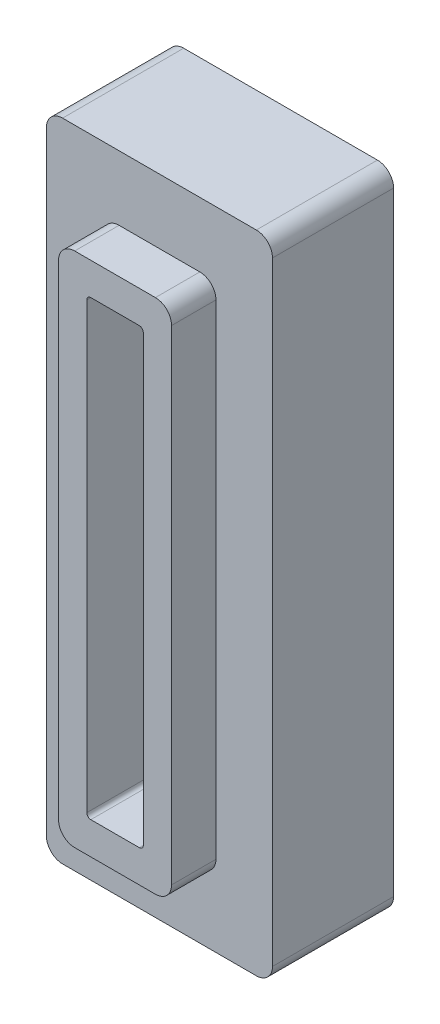
ISO-10303-21;
HEADER;
FILE_DESCRIPTION(('STEP AP214'),'2;1');
FILE_NAME('part.step','',(''),(''),'','','');
FILE_SCHEMA(('AUTOMOTIVE_DESIGN { 1 0 10303 214 1 1 1 1 }'));
ENDSEC;
DATA;
#1=APPLICATION_CONTEXT('core data for automotive mechanical design processes');
#2=APPLICATION_PROTOCOL_DEFINITION('international standard','automotive_design',2000,#1);
#3=PRODUCT_CONTEXT('',#1,'mechanical');
#4=PRODUCT('Part','Part','',(#3));
#5=PRODUCT_RELATED_PRODUCT_CATEGORY('part','',(#4));
#6=PRODUCT_DEFINITION_FORMATION('','',#4);
#7=PRODUCT_DEFINITION_CONTEXT('part definition',#1,'design');
#8=PRODUCT_DEFINITION('design','',#6,#7);
#9=PRODUCT_DEFINITION_SHAPE('','',#8);
#10=(LENGTH_UNIT() NAMED_UNIT(*) SI_UNIT(.MILLI.,.METRE.));
#11=(NAMED_UNIT(*) PLANE_ANGLE_UNIT() SI_UNIT($,.RADIAN.));
#12=(NAMED_UNIT(*) SI_UNIT($,.STERADIAN.) SOLID_ANGLE_UNIT());
#13=UNCERTAINTY_MEASURE_WITH_UNIT(LENGTH_MEASURE(1.E-05),#10,'distance_accuracy_value','');
#14=(GEOMETRIC_REPRESENTATION_CONTEXT(3) GLOBAL_UNCERTAINTY_ASSIGNED_CONTEXT((#13)) GLOBAL_UNIT_ASSIGNED_CONTEXT((#10,
#11,#12)) REPRESENTATION_CONTEXT('',''));
#15=CARTESIAN_POINT('',(0.,0.,0.));
#16=DIRECTION('',(0.,0.,1.));
#17=DIRECTION('',(1.,0.,0.));
#18=AXIS2_PLACEMENT_3D('',#15,#16,#17);
#19=CARTESIAN_POINT('',(0.,0.,1.5));
#20=DIRECTION('',(0.,0.,-1.));
#21=DIRECTION('',(-1.,0.,0.));
#22=AXIS2_PLACEMENT_3D('',#19,#20,#21);
#23=PLANE('',#22);
#24=DIRECTION('',(-1.,0.,0.));
#25=VECTOR('',#24,1.);
#26=CARTESIAN_POINT('',(-7.,20.,1.5));
#27=LINE('',#26,#25);
#28=CARTESIAN_POINT('',(5.99999999999999,20.,1.5));
#29=VERTEX_POINT('',#28);
#30=CARTESIAN_POINT('',(-6.00000000000001,20.,1.5));
#31=VERTEX_POINT('',#30);
#32=EDGE_CURVE('E460',#29,#31,#27,.T.);
#33=ORIENTED_EDGE('',*,*,#32,.T.);
#34=CARTESIAN_POINT('',(-6.,19.,1.5));
#35=DIRECTION('',(0.,0.,-1.));
#36=DIRECTION('',(-1.,0.,0.));
#37=AXIS2_PLACEMENT_3D('',#34,#35,#36);
#38=CIRCLE('',#37,1.);
#39=CARTESIAN_POINT('',(-7.,19.,1.5));
#40=VERTEX_POINT('',#39);
#41=EDGE_CURVE('E392',#31,#40,#38,.F.);
#42=ORIENTED_EDGE('',*,*,#41,.T.);
#43=DIRECTION('',(0.,-1.,0.));
#44=VECTOR('',#43,1.);
#45=CARTESIAN_POINT('',(-7.,-20.,1.5));
#46=LINE('',#45,#44);
#47=CARTESIAN_POINT('',(-7.,-19.,1.5));
#48=VERTEX_POINT('',#47);
#49=EDGE_CURVE('E276',#40,#48,#46,.T.);
#50=ORIENTED_EDGE('',*,*,#49,.T.);
#51=CARTESIAN_POINT('',(-6.,-19.,1.5));
#52=DIRECTION('',(0.,0.,-1.));
#53=DIRECTION('',(-1.,0.,0.));
#54=AXIS2_PLACEMENT_3D('',#51,#52,#53);
#55=CIRCLE('',#54,1.);
#56=CARTESIAN_POINT('',(-6.00000000000001,-20.,1.5));
#57=VERTEX_POINT('',#56);
#58=EDGE_CURVE('E57',#48,#57,#55,.F.);
#59=ORIENTED_EDGE('',*,*,#58,.T.);
#60=DIRECTION('',(1.,0.,0.));
#61=VECTOR('',#60,1.);
#62=CARTESIAN_POINT('',(-7.,-20.,1.5));
#63=LINE('',#62,#61);
#64=CARTESIAN_POINT('',(5.99999999999999,-20.,1.5));
#65=VERTEX_POINT('',#64);
#66=EDGE_CURVE('E272',#57,#65,#63,.T.);
#67=ORIENTED_EDGE('',*,*,#66,.T.);
#68=CARTESIAN_POINT('',(5.99999999999999,-19.,1.5));
#69=DIRECTION('',(0.,0.,-1.));
#70=DIRECTION('',(-1.,0.,0.));
#71=AXIS2_PLACEMENT_3D('',#68,#69,#70);
#72=CIRCLE('',#71,1.);
#73=CARTESIAN_POINT('',(6.99999999999999,-19.,1.5));
#74=VERTEX_POINT('',#73);
#75=EDGE_CURVE('E389',#65,#74,#72,.F.);
#76=ORIENTED_EDGE('',*,*,#75,.T.);
#77=DIRECTION('',(0.,1.,0.));
#78=VECTOR('',#77,1.);
#79=CARTESIAN_POINT('',(6.99999999999999,-20.,1.5));
#80=LINE('',#79,#78);
#81=CARTESIAN_POINT('',(6.99999999999999,19.,1.5));
#82=VERTEX_POINT('',#81);
#83=EDGE_CURVE('E457',#74,#82,#80,.T.);
#84=ORIENTED_EDGE('',*,*,#83,.T.);
#85=CARTESIAN_POINT('',(5.99999999999999,19.,1.5));
#86=DIRECTION('',(0.,0.,-1.));
#87=DIRECTION('',(-1.,0.,0.));
#88=AXIS2_PLACEMENT_3D('',#85,#86,#87);
#89=CIRCLE('',#88,1.);
#90=EDGE_CURVE('E387',#82,#29,#89,.F.);
#91=ORIENTED_EDGE('',*,*,#90,.T.);
#92=EDGE_LOOP('',(#33,#42,#50,#59,#67,#76,#84,#91));
#93=FACE_BOUND('',#92,.T.);
#94=DIRECTION('',(0.,1.,0.));
#95=VECTOR('',#94,1.);
#96=CARTESIAN_POINT('',(3.5,-16.,1.5));
#97=LINE('',#96,#95);
#98=CARTESIAN_POINT('',(3.5,-15.,1.5));
#99=VERTEX_POINT('',#98);
#100=CARTESIAN_POINT('',(3.5,15.,1.5));
#101=VERTEX_POINT('',#100);
#102=EDGE_CURVE('E410',#99,#101,#97,.T.);
#103=ORIENTED_EDGE('',*,*,#102,.F.);
#104=CARTESIAN_POINT('',(2.5,-15.,1.5));
#105=DIRECTION('',(0.,0.,-1.));
#106=DIRECTION('',(-1.,0.,0.));
#107=AXIS2_PLACEMENT_3D('',#104,#105,#106);
#108=CIRCLE('',#107,1.);
#109=CARTESIAN_POINT('',(2.5,-16.,1.5));
#110=VERTEX_POINT('',#109);
#111=EDGE_CURVE('E403',#99,#110,#108,.T.);
#112=ORIENTED_EDGE('',*,*,#111,.T.);
#113=DIRECTION('',(1.,0.,0.));
#114=VECTOR('',#113,1.);
#115=CARTESIAN_POINT('',(-3.5,-16.,1.5));
#116=LINE('',#115,#114);
#117=CARTESIAN_POINT('',(-2.5,-16.,1.5));
#118=VERTEX_POINT('',#117);
#119=EDGE_CURVE('E441',#118,#110,#116,.T.);
#120=ORIENTED_EDGE('',*,*,#119,.F.);
#121=CARTESIAN_POINT('',(-2.5,-15.,1.5));
#122=DIRECTION('',(0.,0.,-1.));
#123=DIRECTION('',(-1.,0.,0.));
#124=AXIS2_PLACEMENT_3D('',#121,#122,#123);
#125=CIRCLE('',#124,1.);
#126=CARTESIAN_POINT('',(-3.5,-15.,1.5));
#127=VERTEX_POINT('',#126);
#128=EDGE_CURVE('E405',#118,#127,#125,.T.);
#129=ORIENTED_EDGE('',*,*,#128,.T.);
#130=DIRECTION('',(0.,-1.,0.));
#131=VECTOR('',#130,1.);
#132=CARTESIAN_POINT('',(-3.5,-16.,1.5));
#133=LINE('',#132,#131);
#134=CARTESIAN_POINT('',(-3.5,15.,1.5));
#135=VERTEX_POINT('',#134);
#136=EDGE_CURVE('E447',#135,#127,#133,.T.);
#137=ORIENTED_EDGE('',*,*,#136,.F.);
#138=CARTESIAN_POINT('',(-2.5,15.,1.5));
#139=DIRECTION('',(0.,0.,-1.));
#140=DIRECTION('',(-1.,0.,0.));
#141=AXIS2_PLACEMENT_3D('',#138,#139,#140);
#142=CIRCLE('',#141,1.);
#143=CARTESIAN_POINT('',(-2.5,16.,1.5));
#144=VERTEX_POINT('',#143);
#145=EDGE_CURVE('E11',#135,#144,#142,.T.);
#146=ORIENTED_EDGE('',*,*,#145,.T.);
#147=DIRECTION('',(-1.,0.,0.));
#148=VECTOR('',#147,1.);
#149=CARTESIAN_POINT('',(-3.5,16.,1.5));
#150=LINE('',#149,#148);
#151=CARTESIAN_POINT('',(2.5,16.,1.5));
#152=VERTEX_POINT('',#151);
#153=EDGE_CURVE('E412',#152,#144,#150,.T.);
#154=ORIENTED_EDGE('',*,*,#153,.F.);
#155=CARTESIAN_POINT('',(2.5,15.,1.5));
#156=DIRECTION('',(0.,0.,-1.));
#157=DIRECTION('',(-1.,0.,0.));
#158=AXIS2_PLACEMENT_3D('',#155,#156,#157);
#159=CIRCLE('',#158,1.);
#160=EDGE_CURVE('E43',#152,#101,#159,.T.);
#161=ORIENTED_EDGE('',*,*,#160,.T.);
#162=EDGE_LOOP('',(#103,#112,#120,#129,#137,#146,#154,#161));
#163=FACE_BOUND('',#162,.T.);
#164=ADVANCED_FACE('F35',(#93,#163),#23,.F.);
#165=CARTESIAN_POINT('',(0.,0.,0.));
#166=DIRECTION('',(0.,0.,-1.));
#167=DIRECTION('',(-1.,0.,0.));
#168=AXIS2_PLACEMENT_3D('',#165,#166,#167);
#169=PLANE('',#168);
#170=DIRECTION('',(0.,-1.,0.));
#171=VECTOR('',#170,1.);
#172=CARTESIAN_POINT('',(4.9,-17.7,0.));
#173=LINE('',#172,#171);
#174=CARTESIAN_POINT('',(4.9,17.45,0.));
#175=VERTEX_POINT('',#174);
#176=CARTESIAN_POINT('',(4.9,-17.45,0.));
#177=VERTEX_POINT('',#176);
#178=EDGE_CURVE('E913',#175,#177,#173,.T.);
#179=ORIENTED_EDGE('',*,*,#178,.T.);
#180=CARTESIAN_POINT('',(4.65,-17.45,0.));
#181=DIRECTION('',(0.,0.,-1.));
#182=DIRECTION('',(-1.,0.,0.));
#183=AXIS2_PLACEMENT_3D('',#180,#181,#182);
#184=CIRCLE('',#183,0.25);
#185=CARTESIAN_POINT('',(4.65,-17.7,0.));
#186=VERTEX_POINT('',#185);
#187=EDGE_CURVE('E304',#177,#186,#184,.T.);
#188=ORIENTED_EDGE('',*,*,#187,.T.);
#189=DIRECTION('',(-1.,0.,0.));
#190=VECTOR('',#189,1.);
#191=CARTESIAN_POINT('',(4.9,-17.7,0.));
#192=LINE('',#191,#190);
#193=CARTESIAN_POINT('',(-4.65,-17.7,0.));
#194=VERTEX_POINT('',#193);
#195=EDGE_CURVE('E916',#186,#194,#192,.T.);
#196=ORIENTED_EDGE('',*,*,#195,.T.);
#197=CARTESIAN_POINT('',(-4.65,-17.45,0.));
#198=DIRECTION('',(0.,0.,-1.));
#199=DIRECTION('',(-1.,0.,0.));
#200=AXIS2_PLACEMENT_3D('',#197,#198,#199);
#201=CIRCLE('',#200,0.25);
#202=CARTESIAN_POINT('',(-4.9,-17.45,0.));
#203=VERTEX_POINT('',#202);
#204=EDGE_CURVE('E302',#194,#203,#201,.T.);
#205=ORIENTED_EDGE('',*,*,#204,.T.);
#206=DIRECTION('',(0.,1.,0.));
#207=VECTOR('',#206,1.);
#208=CARTESIAN_POINT('',(-4.9,-17.7,0.));
#209=LINE('',#208,#207);
#210=CARTESIAN_POINT('',(-4.9,17.45,0.));
#211=VERTEX_POINT('',#210);
#212=EDGE_CURVE('E885',#203,#211,#209,.T.);
#213=ORIENTED_EDGE('',*,*,#212,.T.);
#214=CARTESIAN_POINT('',(-4.65,17.45,0.));
#215=DIRECTION('',(0.,0.,-1.));
#216=DIRECTION('',(-1.,0.,0.));
#217=AXIS2_PLACEMENT_3D('',#214,#215,#216);
#218=CIRCLE('',#217,0.25);
#219=CARTESIAN_POINT('',(-4.65,17.7,0.));
#220=VERTEX_POINT('',#219);
#221=EDGE_CURVE('E300',#211,#220,#218,.T.);
#222=ORIENTED_EDGE('',*,*,#221,.T.);
#223=DIRECTION('',(1.,0.,0.));
#224=VECTOR('',#223,1.);
#225=CARTESIAN_POINT('',(4.9,17.7,0.));
#226=LINE('',#225,#224);
#227=CARTESIAN_POINT('',(4.65,17.7,0.));
#228=VERTEX_POINT('',#227);
#229=EDGE_CURVE('E890',#220,#228,#226,.T.);
#230=ORIENTED_EDGE('',*,*,#229,.T.);
#231=CARTESIAN_POINT('',(4.65,17.45,0.));
#232=DIRECTION('',(0.,0.,-1.));
#233=DIRECTION('',(-1.,0.,0.));
#234=AXIS2_PLACEMENT_3D('',#231,#232,#233);
#235=CIRCLE('',#234,0.25);
#236=EDGE_CURVE('E298',#228,#175,#235,.T.);
#237=ORIENTED_EDGE('',*,*,#236,.T.);
#238=EDGE_LOOP('',(#179,#188,#196,#205,#213,#222,#230,#237));
#239=FACE_BOUND('',#238,.T.);
#240=DIRECTION('',(0.,-1.,0.));
#241=VECTOR('',#240,1.);
#242=CARTESIAN_POINT('',(-1.75,-14.,0.));
#243=LINE('',#242,#241);
#244=CARTESIAN_POINT('',(-1.75,13.75,0.));
#245=VERTEX_POINT('',#244);
#246=CARTESIAN_POINT('',(-1.75,-13.75,0.));
#247=VERTEX_POINT('',#246);
#248=EDGE_CURVE('E454',#245,#247,#243,.T.);
#249=ORIENTED_EDGE('',*,*,#248,.T.);
#250=CARTESIAN_POINT('',(-1.5,-13.75,0.));
#251=DIRECTION('',(0.,0.,-1.));
#252=DIRECTION('',(-1.,0.,0.));
#253=AXIS2_PLACEMENT_3D('',#250,#251,#252);
#254=CIRCLE('',#253,0.25);
#255=CARTESIAN_POINT('',(-1.5,-14.,0.));
#256=VERTEX_POINT('',#255);
#257=EDGE_CURVE('E329',#247,#256,#254,.F.);
#258=ORIENTED_EDGE('',*,*,#257,.T.);
#259=DIRECTION('',(1.,0.,0.));
#260=VECTOR('',#259,1.);
#261=CARTESIAN_POINT('',(-1.75,-14.,0.));
#262=LINE('',#261,#260);
#263=CARTESIAN_POINT('',(1.5,-14.,0.));
#264=VERTEX_POINT('',#263);
#265=EDGE_CURVE('E251',#256,#264,#262,.T.);
#266=ORIENTED_EDGE('',*,*,#265,.T.);
#267=CARTESIAN_POINT('',(1.5,-13.75,0.));
#268=DIRECTION('',(0.,0.,-1.));
#269=DIRECTION('',(-1.,0.,0.));
#270=AXIS2_PLACEMENT_3D('',#267,#268,#269);
#271=CIRCLE('',#270,0.25);
#272=CARTESIAN_POINT('',(1.75,-13.75,0.));
#273=VERTEX_POINT('',#272);
#274=EDGE_CURVE('E245',#264,#273,#271,.F.);
#275=ORIENTED_EDGE('',*,*,#274,.T.);
#276=DIRECTION('',(0.,1.,0.));
#277=VECTOR('',#276,1.);
#278=CARTESIAN_POINT('',(1.75,-14.,0.));
#279=LINE('',#278,#277);
#280=CARTESIAN_POINT('',(1.75,13.75,0.));
#281=VERTEX_POINT('',#280);
#282=EDGE_CURVE('E249',#273,#281,#279,.T.);
#283=ORIENTED_EDGE('',*,*,#282,.T.);
#284=CARTESIAN_POINT('',(1.5,13.75,0.));
#285=DIRECTION('',(0.,0.,-1.));
#286=DIRECTION('',(-1.,0.,0.));
#287=AXIS2_PLACEMENT_3D('',#284,#285,#286);
#288=CIRCLE('',#287,0.25);
#289=CARTESIAN_POINT('',(1.5,14.,0.));
#290=VERTEX_POINT('',#289);
#291=EDGE_CURVE('E321',#281,#290,#288,.F.);
#292=ORIENTED_EDGE('',*,*,#291,.T.);
#293=DIRECTION('',(-1.,0.,0.));
#294=VECTOR('',#293,1.);
#295=CARTESIAN_POINT('',(-1.75,14.,0.));
#296=LINE('',#295,#294);
#297=CARTESIAN_POINT('',(-1.5,14.,0.));
#298=VERTEX_POINT('',#297);
#299=EDGE_CURVE('E267',#290,#298,#296,.T.);
#300=ORIENTED_EDGE('',*,*,#299,.T.);
#301=CARTESIAN_POINT('',(-1.5,13.75,0.));
#302=DIRECTION('',(0.,0.,-1.));
#303=DIRECTION('',(-1.,0.,0.));
#304=AXIS2_PLACEMENT_3D('',#301,#302,#303);
#305=CIRCLE('',#304,0.25);
#306=EDGE_CURVE('E325',#298,#245,#305,.F.);
#307=ORIENTED_EDGE('',*,*,#306,.T.);
#308=EDGE_LOOP('',(#249,#258,#266,#275,#283,#292,#300,#307));
#309=FACE_BOUND('',#308,.T.);
#310=ADVANCED_FACE('F248',(#239,#309),#169,.T.);
#311=CARTESIAN_POINT('',(6.99999999999999,-20.,1.5));
#312=DIRECTION('',(-1.,0.,0.));
#313=DIRECTION('',(0.,0.,1.));
#314=AXIS2_PLACEMENT_3D('',#311,#312,#313);
#315=PLANE('',#314);
#316=ORIENTED_EDGE('',*,*,#83,.F.);
#317=DIRECTION('',(0.,0.,-1.));
#318=VECTOR('',#317,1.);
#319=CARTESIAN_POINT('',(6.99999999999999,-19.,1.5));
#320=LINE('',#319,#318);
#321=CARTESIAN_POINT('',(6.99999999999999,-19.,-6.));
#322=VERTEX_POINT('',#321);
#323=EDGE_CURVE('E400',#74,#322,#320,.T.);
#324=ORIENTED_EDGE('',*,*,#323,.T.);
#325=DIRECTION('',(0.,-1.,0.));
#326=VECTOR('',#325,1.);
#327=CARTESIAN_POINT('',(6.99999999999999,20.,-6.));
#328=LINE('',#327,#326);
#329=CARTESIAN_POINT('',(6.99999999999999,19.,-6.));
#330=VERTEX_POINT('',#329);
#331=EDGE_CURVE('E480',#330,#322,#328,.T.);
#332=ORIENTED_EDGE('',*,*,#331,.F.);
#333=DIRECTION('',(0.,0.,-1.));
#334=VECTOR('',#333,1.);
#335=CARTESIAN_POINT('',(6.99999999999999,19.,1.5));
#336=LINE('',#335,#334);
#337=EDGE_CURVE('E398',#330,#82,#336,.F.);
#338=ORIENTED_EDGE('',*,*,#337,.T.);
#339=EDGE_LOOP('',(#316,#324,#332,#338));
#340=FACE_BOUND('',#339,.T.);
#341=ADVANCED_FACE('F537',(#340),#315,.F.);
#342=CARTESIAN_POINT('',(-7.,20.,1.5));
#343=DIRECTION('',(0.,-1.,0.));
#344=DIRECTION('',(0.,0.,-1.));
#345=AXIS2_PLACEMENT_3D('',#342,#343,#344);
#346=PLANE('',#345);
#347=DIRECTION('',(1.,0.,0.));
#348=VECTOR('',#347,1.);
#349=CARTESIAN_POINT('',(-7.,20.,-6.));
#350=LINE('',#349,#348);
#351=CARTESIAN_POINT('',(-6.00000000000001,20.,-6.));
#352=VERTEX_POINT('',#351);
#353=CARTESIAN_POINT('',(5.99999999999999,20.,-6.));
#354=VERTEX_POINT('',#353);
#355=EDGE_CURVE('E484',#352,#354,#350,.T.);
#356=ORIENTED_EDGE('',*,*,#355,.F.);
#357=DIRECTION('',(0.,0.,-1.));
#358=VECTOR('',#357,1.);
#359=CARTESIAN_POINT('',(-6.,20.,1.5));
#360=LINE('',#359,#358);
#361=EDGE_CURVE('E385',#352,#31,#360,.F.);
#362=ORIENTED_EDGE('',*,*,#361,.T.);
#363=ORIENTED_EDGE('',*,*,#32,.F.);
#364=DIRECTION('',(0.,0.,-1.));
#365=VECTOR('',#364,1.);
#366=CARTESIAN_POINT('',(5.99999999999999,20.,1.5));
#367=LINE('',#366,#365);
#368=EDGE_CURVE('E382',#29,#354,#367,.T.);
#369=ORIENTED_EDGE('',*,*,#368,.T.);
#370=EDGE_LOOP('',(#356,#362,#363,#369));
#371=FACE_BOUND('',#370,.T.);
#372=ADVANCED_FACE('F548',(#371),#346,.F.);
#373=CARTESIAN_POINT('',(-7.,-20.,1.5));
#374=DIRECTION('',(1.,0.,0.));
#375=DIRECTION('',(0.,0.,-1.));
#376=AXIS2_PLACEMENT_3D('',#373,#374,#375);
#377=PLANE('',#376);
#378=ORIENTED_EDGE('',*,*,#49,.F.);
#379=DIRECTION('',(0.,0.,-1.));
#380=VECTOR('',#379,1.);
#381=CARTESIAN_POINT('',(-7.,19.,1.5));
#382=LINE('',#381,#380);
#383=CARTESIAN_POINT('',(-7.,19.,-6.));
#384=VERTEX_POINT('',#383);
#385=EDGE_CURVE('E371',#40,#384,#382,.T.);
#386=ORIENTED_EDGE('',*,*,#385,.T.);
#387=DIRECTION('',(0.,1.,0.));
#388=VECTOR('',#387,1.);
#389=CARTESIAN_POINT('',(-7.,-20.,-6.));
#390=LINE('',#389,#388);
#391=CARTESIAN_POINT('',(-7.,-19.,-6.));
#392=VERTEX_POINT('',#391);
#393=EDGE_CURVE('E479',#392,#384,#390,.T.);
#394=ORIENTED_EDGE('',*,*,#393,.F.);
#395=DIRECTION('',(0.,0.,-1.));
#396=VECTOR('',#395,1.);
#397=CARTESIAN_POINT('',(-7.,-19.,1.5));
#398=LINE('',#397,#396);
#399=EDGE_CURVE('E369',#392,#48,#398,.F.);
#400=ORIENTED_EDGE('',*,*,#399,.T.);
#401=EDGE_LOOP('',(#378,#386,#394,#400));
#402=FACE_BOUND('',#401,.T.);
#403=ADVANCED_FACE('F545',(#402),#377,.F.);
#404=CARTESIAN_POINT('',(-7.,-20.,1.5));
#405=DIRECTION('',(0.,1.,0.));
#406=DIRECTION('',(0.,0.,1.));
#407=AXIS2_PLACEMENT_3D('',#404,#405,#406);
#408=PLANE('',#407);
#409=ORIENTED_EDGE('',*,*,#66,.F.);
#410=DIRECTION('',(0.,0.,-1.));
#411=VECTOR('',#410,1.);
#412=CARTESIAN_POINT('',(-6.,-20.,1.5));
#413=LINE('',#412,#411);
#414=CARTESIAN_POINT('',(-6.,-20.,-6.));
#415=VERTEX_POINT('',#414);
#416=EDGE_CURVE('E395',#57,#415,#413,.T.);
#417=ORIENTED_EDGE('',*,*,#416,.T.);
#418=DIRECTION('',(-1.,0.,0.));
#419=VECTOR('',#418,1.);
#420=CARTESIAN_POINT('',(6.99999999999999,-20.,-6.));
#421=LINE('',#420,#419);
#422=CARTESIAN_POINT('',(5.99999999999999,-20.,-6.));
#423=VERTEX_POINT('',#422);
#424=EDGE_CURVE('E472',#423,#415,#421,.T.);
#425=ORIENTED_EDGE('',*,*,#424,.F.);
#426=DIRECTION('',(0.,0.,-1.));
#427=VECTOR('',#426,1.);
#428=CARTESIAN_POINT('',(5.99999999999999,-20.,1.5));
#429=LINE('',#428,#427);
#430=EDGE_CURVE('E50',#423,#65,#429,.F.);
#431=ORIENTED_EDGE('',*,*,#430,.T.);
#432=EDGE_LOOP('',(#409,#417,#425,#431));
#433=FACE_BOUND('',#432,.T.);
#434=ADVANCED_FACE('F471',(#433),#408,.F.);
#435=CARTESIAN_POINT('',(1.75,-14.,1.5));
#436=DIRECTION('',(-1.,0.,0.));
#437=DIRECTION('',(0.,0.,1.));
#438=AXIS2_PLACEMENT_3D('',#435,#436,#437);
#439=PLANE('',#438);
#440=DIRECTION('',(0.,1.,0.));
#441=VECTOR('',#440,1.);
#442=CARTESIAN_POINT('',(1.75,-14.,4.25));
#443=LINE('',#442,#441);
#444=CARTESIAN_POINT('',(1.75,-13.75,4.25));
#445=VERTEX_POINT('',#444);
#446=CARTESIAN_POINT('',(1.75,13.75,4.25));
#447=VERTEX_POINT('',#446);
#448=EDGE_CURVE('E493',#445,#447,#443,.T.);
#449=ORIENTED_EDGE('',*,*,#448,.T.);
#450=DIRECTION('',(0.,0.,-1.));
#451=VECTOR('',#450,1.);
#452=CARTESIAN_POINT('',(1.75,13.75,0.));
#453=LINE('',#452,#451);
#454=EDGE_CURVE('E266',#447,#281,#453,.T.);
#455=ORIENTED_EDGE('',*,*,#454,.T.);
#456=ORIENTED_EDGE('',*,*,#282,.F.);
#457=DIRECTION('',(0.,0.,-1.));
#458=VECTOR('',#457,1.);
#459=CARTESIAN_POINT('',(1.75,-13.75,4.25));
#460=LINE('',#459,#458);
#461=EDGE_CURVE('E263',#273,#445,#460,.F.);
#462=ORIENTED_EDGE('',*,*,#461,.T.);
#463=EDGE_LOOP('',(#449,#455,#456,#462));
#464=FACE_BOUND('',#463,.T.);
#465=ADVANCED_FACE('F262',(#464),#439,.T.);
#466=CARTESIAN_POINT('',(-1.75,14.,1.5));
#467=DIRECTION('',(0.,-1.,0.));
#468=DIRECTION('',(0.,0.,-1.));
#469=AXIS2_PLACEMENT_3D('',#466,#467,#468);
#470=PLANE('',#469);
#471=ORIENTED_EDGE('',*,*,#299,.F.);
#472=DIRECTION('',(0.,0.,-1.));
#473=VECTOR('',#472,1.);
#474=CARTESIAN_POINT('',(1.5,14.,4.25));
#475=LINE('',#474,#473);
#476=CARTESIAN_POINT('',(1.5,14.,4.25));
#477=VERTEX_POINT('',#476);
#478=EDGE_CURVE('E282',#290,#477,#475,.F.);
#479=ORIENTED_EDGE('',*,*,#478,.T.);
#480=DIRECTION('',(-1.,0.,0.));
#481=VECTOR('',#480,1.);
#482=CARTESIAN_POINT('',(1.75,14.,4.25));
#483=LINE('',#482,#481);
#484=CARTESIAN_POINT('',(-1.5,14.,4.25));
#485=VERTEX_POINT('',#484);
#486=EDGE_CURVE('E421',#477,#485,#483,.T.);
#487=ORIENTED_EDGE('',*,*,#486,.T.);
#488=DIRECTION('',(0.,0.,-1.));
#489=VECTOR('',#488,1.);
#490=CARTESIAN_POINT('',(-1.5,14.,0.));
#491=LINE('',#490,#489);
#492=EDGE_CURVE('E274',#485,#298,#491,.T.);
#493=ORIENTED_EDGE('',*,*,#492,.T.);
#494=EDGE_LOOP('',(#471,#479,#487,#493));
#495=FACE_BOUND('',#494,.T.);
#496=ADVANCED_FACE('F499',(#495),#470,.T.);
#497=CARTESIAN_POINT('',(-1.75,-14.,1.5));
#498=DIRECTION('',(1.,0.,0.));
#499=DIRECTION('',(0.,0.,-1.));
#500=AXIS2_PLACEMENT_3D('',#497,#498,#499);
#501=PLANE('',#500);
#502=ORIENTED_EDGE('',*,*,#248,.F.);
#503=DIRECTION('',(0.,0.,-1.));
#504=VECTOR('',#503,1.);
#505=CARTESIAN_POINT('',(-1.75,13.75,4.25));
#506=LINE('',#505,#504);
#507=CARTESIAN_POINT('',(-1.75,13.75,4.25));
#508=VERTEX_POINT('',#507);
#509=EDGE_CURVE('E287',#245,#508,#506,.F.);
#510=ORIENTED_EDGE('',*,*,#509,.T.);
#511=DIRECTION('',(0.,-1.,0.));
#512=VECTOR('',#511,1.);
#513=CARTESIAN_POINT('',(-1.75,14.,4.25));
#514=LINE('',#513,#512);
#515=CARTESIAN_POINT('',(-1.75,-13.75,4.25));
#516=VERTEX_POINT('',#515);
#517=EDGE_CURVE('E482',#508,#516,#514,.T.);
#518=ORIENTED_EDGE('',*,*,#517,.T.);
#519=DIRECTION('',(0.,0.,-1.));
#520=VECTOR('',#519,1.);
#521=CARTESIAN_POINT('',(-1.75,-13.75,0.));
#522=LINE('',#521,#520);
#523=EDGE_CURVE('E284',#516,#247,#522,.T.);
#524=ORIENTED_EDGE('',*,*,#523,.T.);
#525=EDGE_LOOP('',(#502,#510,#518,#524));
#526=FACE_BOUND('',#525,.T.);
#527=ADVANCED_FACE('F508',(#526),#501,.T.);
#528=CARTESIAN_POINT('',(-1.75,-14.,1.5));
#529=DIRECTION('',(0.,1.,0.));
#530=DIRECTION('',(0.,0.,1.));
#531=AXIS2_PLACEMENT_3D('',#528,#529,#530);
#532=PLANE('',#531);
#533=ORIENTED_EDGE('',*,*,#265,.F.);
#534=DIRECTION('',(0.,0.,-1.));
#535=VECTOR('',#534,1.);
#536=CARTESIAN_POINT('',(-1.5,-14.,4.25));
#537=LINE('',#536,#535);
#538=CARTESIAN_POINT('',(-1.5,-14.,4.25));
#539=VERTEX_POINT('',#538);
#540=EDGE_CURVE('E291',#256,#539,#537,.F.);
#541=ORIENTED_EDGE('',*,*,#540,.T.);
#542=DIRECTION('',(1.,0.,0.));
#543=VECTOR('',#542,1.);
#544=CARTESIAN_POINT('',(-1.75,-14.,4.25));
#545=LINE('',#544,#543);
#546=CARTESIAN_POINT('',(1.5,-14.,4.25));
#547=VERTEX_POINT('',#546);
#548=EDGE_CURVE('E490',#539,#547,#545,.T.);
#549=ORIENTED_EDGE('',*,*,#548,.T.);
#550=DIRECTION('',(0.,0.,-1.));
#551=VECTOR('',#550,1.);
#552=CARTESIAN_POINT('',(1.5,-14.,0.));
#553=LINE('',#552,#551);
#554=EDGE_CURVE('E289',#547,#264,#553,.T.);
#555=ORIENTED_EDGE('',*,*,#554,.T.);
#556=EDGE_LOOP('',(#533,#541,#549,#555));
#557=FACE_BOUND('',#556,.T.);
#558=ADVANCED_FACE('F516',(#557),#532,.T.);
#559=CARTESIAN_POINT('',(0.,0.,4.25));
#560=DIRECTION('',(0.,0.,-1.));
#561=DIRECTION('',(-1.,0.,0.));
#562=AXIS2_PLACEMENT_3D('',#559,#560,#561);
#563=PLANE('',#562);
#564=DIRECTION('',(1.,0.,0.));
#565=VECTOR('',#564,1.);
#566=CARTESIAN_POINT('',(-3.5,-16.,4.25));
#567=LINE('',#566,#565);
#568=CARTESIAN_POINT('',(-2.5,-16.,4.25));
#569=VERTEX_POINT('',#568);
#570=CARTESIAN_POINT('',(2.5,-16.,4.25));
#571=VERTEX_POINT('',#570);
#572=EDGE_CURVE('E268',#569,#571,#567,.T.);
#573=ORIENTED_EDGE('',*,*,#572,.T.);
#574=CARTESIAN_POINT('',(2.5,-15.,4.25));
#575=DIRECTION('',(0.,0.,-1.));
#576=DIRECTION('',(-1.,0.,0.));
#577=AXIS2_PLACEMENT_3D('',#574,#575,#576);
#578=CIRCLE('',#577,1.);
#579=CARTESIAN_POINT('',(3.5,-15.,4.25));
#580=VERTEX_POINT('',#579);
#581=EDGE_CURVE('E357',#571,#580,#578,.F.);
#582=ORIENTED_EDGE('',*,*,#581,.T.);
#583=DIRECTION('',(0.,1.,0.));
#584=VECTOR('',#583,1.);
#585=CARTESIAN_POINT('',(3.5,-16.,4.25));
#586=LINE('',#585,#584);
#587=CARTESIAN_POINT('',(3.5,15.,4.25));
#588=VERTEX_POINT('',#587);
#589=EDGE_CURVE('E433',#580,#588,#586,.T.);
#590=ORIENTED_EDGE('',*,*,#589,.T.);
#591=CARTESIAN_POINT('',(2.5,15.,4.25));
#592=DIRECTION('',(0.,0.,-1.));
#593=DIRECTION('',(-1.,0.,0.));
#594=AXIS2_PLACEMENT_3D('',#591,#592,#593);
#595=CIRCLE('',#594,1.);
#596=CARTESIAN_POINT('',(2.5,16.,4.25));
#597=VERTEX_POINT('',#596);
#598=EDGE_CURVE('E353',#588,#597,#595,.F.);
#599=ORIENTED_EDGE('',*,*,#598,.T.);
#600=DIRECTION('',(-1.,0.,0.));
#601=VECTOR('',#600,1.);
#602=CARTESIAN_POINT('',(-3.5,16.,4.25));
#603=LINE('',#602,#601);
#604=CARTESIAN_POINT('',(-2.5,16.,4.25));
#605=VERTEX_POINT('',#604);
#606=EDGE_CURVE('E431',#597,#605,#603,.T.);
#607=ORIENTED_EDGE('',*,*,#606,.T.);
#608=CARTESIAN_POINT('',(-2.5,15.,4.25));
#609=DIRECTION('',(0.,0.,-1.));
#610=DIRECTION('',(-1.,0.,0.));
#611=AXIS2_PLACEMENT_3D('',#608,#609,#610);
#612=CIRCLE('',#611,1.);
#613=CARTESIAN_POINT('',(-3.5,15.,4.25));
#614=VERTEX_POINT('',#613);
#615=EDGE_CURVE('E351',#605,#614,#612,.F.);
#616=ORIENTED_EDGE('',*,*,#615,.T.);
#617=DIRECTION('',(0.,-1.,0.));
#618=VECTOR('',#617,1.);
#619=CARTESIAN_POINT('',(-3.5,-16.,4.25));
#620=LINE('',#619,#618);
#621=CARTESIAN_POINT('',(-3.5,-15.,4.25));
#622=VERTEX_POINT('',#621);
#623=EDGE_CURVE('E437',#614,#622,#620,.T.);
#624=ORIENTED_EDGE('',*,*,#623,.T.);
#625=CARTESIAN_POINT('',(-2.5,-15.,4.25));
#626=DIRECTION('',(0.,0.,-1.));
#627=DIRECTION('',(-1.,0.,0.));
#628=AXIS2_PLACEMENT_3D('',#625,#626,#627);
#629=CIRCLE('',#628,1.);
#630=EDGE_CURVE('E355',#622,#569,#629,.F.);
#631=ORIENTED_EDGE('',*,*,#630,.T.);
#632=EDGE_LOOP('',(#573,#582,#590,#599,#607,#616,#624,#631));
#633=FACE_BOUND('',#632,.T.);
#634=ORIENTED_EDGE('',*,*,#517,.F.);
#635=CARTESIAN_POINT('',(-1.5,13.75,4.25));
#636=DIRECTION('',(0.,0.,-1.));
#637=DIRECTION('',(-1.,0.,0.));
#638=AXIS2_PLACEMENT_3D('',#635,#636,#637);
#639=CIRCLE('',#638,0.25);
#640=EDGE_CURVE('E327',#508,#485,#639,.T.);
#641=ORIENTED_EDGE('',*,*,#640,.T.);
#642=ORIENTED_EDGE('',*,*,#486,.F.);
#643=CARTESIAN_POINT('',(1.5,13.75,4.25));
#644=DIRECTION('',(0.,0.,-1.));
#645=DIRECTION('',(-1.,0.,0.));
#646=AXIS2_PLACEMENT_3D('',#643,#644,#645);
#647=CIRCLE('',#646,0.25);
#648=EDGE_CURVE('E323',#477,#447,#647,.T.);
#649=ORIENTED_EDGE('',*,*,#648,.T.);
#650=ORIENTED_EDGE('',*,*,#448,.F.);
#651=CARTESIAN_POINT('',(1.5,-13.75,4.25));
#652=DIRECTION('',(0.,0.,-1.));
#653=DIRECTION('',(-1.,0.,0.));
#654=AXIS2_PLACEMENT_3D('',#651,#652,#653);
#655=CIRCLE('',#654,0.25);
#656=EDGE_CURVE('E256',#445,#547,#655,.T.);
#657=ORIENTED_EDGE('',*,*,#656,.T.);
#658=ORIENTED_EDGE('',*,*,#548,.F.);
#659=CARTESIAN_POINT('',(-1.5,-13.75,4.25));
#660=DIRECTION('',(0.,0.,-1.));
#661=DIRECTION('',(-1.,0.,0.));
#662=AXIS2_PLACEMENT_3D('',#659,#660,#661);
#663=CIRCLE('',#662,0.25);
#664=EDGE_CURVE('E257',#539,#516,#663,.T.);
#665=ORIENTED_EDGE('',*,*,#664,.T.);
#666=EDGE_LOOP('',(#634,#641,#642,#649,#650,#657,#658,#665));
#667=FACE_BOUND('',#666,.T.);
#668=ADVANCED_FACE('F429',(#633,#667),#563,.F.);
#669=CARTESIAN_POINT('',(3.5,-16.,4.25));
#670=DIRECTION('',(-1.,0.,0.));
#671=DIRECTION('',(0.,0.,1.));
#672=AXIS2_PLACEMENT_3D('',#669,#670,#671);
#673=PLANE('',#672);
#674=ORIENTED_EDGE('',*,*,#589,.F.);
#675=DIRECTION('',(0.,0.,-1.));
#676=VECTOR('',#675,1.);
#677=CARTESIAN_POINT('',(3.5,-15.,4.25));
#678=LINE('',#677,#676);
#679=EDGE_CURVE('E343',#580,#99,#678,.T.);
#680=ORIENTED_EDGE('',*,*,#679,.T.);
#681=ORIENTED_EDGE('',*,*,#102,.T.);
#682=DIRECTION('',(0.,0.,-1.));
#683=VECTOR('',#682,1.);
#684=CARTESIAN_POINT('',(3.5,15.,4.25));
#685=LINE('',#684,#683);
#686=EDGE_CURVE('E341',#101,#588,#685,.F.);
#687=ORIENTED_EDGE('',*,*,#686,.T.);
#688=EDGE_LOOP('',(#674,#680,#681,#687));
#689=FACE_BOUND('',#688,.T.);
#690=ADVANCED_FACE('F418',(#689),#673,.F.);
#691=CARTESIAN_POINT('',(-3.5,16.,4.25));
#692=DIRECTION('',(0.,-1.,0.));
#693=DIRECTION('',(0.,0.,-1.));
#694=AXIS2_PLACEMENT_3D('',#691,#692,#693);
#695=PLANE('',#694);
#696=ORIENTED_EDGE('',*,*,#606,.F.);
#697=DIRECTION('',(0.,0.,-1.));
#698=VECTOR('',#697,1.);
#699=CARTESIAN_POINT('',(2.5,16.,4.25));
#700=LINE('',#699,#698);
#701=EDGE_CURVE('E366',#597,#152,#700,.T.);
#702=ORIENTED_EDGE('',*,*,#701,.T.);
#703=ORIENTED_EDGE('',*,*,#153,.T.);
#704=DIRECTION('',(0.,0.,-1.));
#705=VECTOR('',#704,1.);
#706=CARTESIAN_POINT('',(-2.5,16.,4.25));
#707=LINE('',#706,#705);
#708=EDGE_CURVE('E364',#144,#605,#707,.F.);
#709=ORIENTED_EDGE('',*,*,#708,.T.);
#710=EDGE_LOOP('',(#696,#702,#703,#709));
#711=FACE_BOUND('',#710,.T.);
#712=ADVANCED_FACE('F435',(#711),#695,.F.);
#713=CARTESIAN_POINT('',(-3.5,-16.,4.25));
#714=DIRECTION('',(1.,0.,0.));
#715=DIRECTION('',(0.,0.,-1.));
#716=AXIS2_PLACEMENT_3D('',#713,#714,#715);
#717=PLANE('',#716);
#718=ORIENTED_EDGE('',*,*,#136,.T.);
#719=DIRECTION('',(0.,0.,-1.));
#720=VECTOR('',#719,1.);
#721=CARTESIAN_POINT('',(-3.5,-15.,4.25));
#722=LINE('',#721,#720);
#723=EDGE_CURVE('E362',#127,#622,#722,.F.);
#724=ORIENTED_EDGE('',*,*,#723,.T.);
#725=ORIENTED_EDGE('',*,*,#623,.F.);
#726=DIRECTION('',(0.,0.,-1.));
#727=VECTOR('',#726,1.);
#728=CARTESIAN_POINT('',(-3.5,15.,4.25));
#729=LINE('',#728,#727);
#730=EDGE_CURVE('E359',#614,#135,#729,.T.);
#731=ORIENTED_EDGE('',*,*,#730,.T.);
#732=EDGE_LOOP('',(#718,#724,#725,#731));
#733=FACE_BOUND('',#732,.T.);
#734=ADVANCED_FACE('F780',(#733),#717,.F.);
#735=CARTESIAN_POINT('',(-3.5,-16.,4.25));
#736=DIRECTION('',(0.,1.,0.));
#737=DIRECTION('',(0.,0.,1.));
#738=AXIS2_PLACEMENT_3D('',#735,#736,#737);
#739=PLANE('',#738);
#740=ORIENTED_EDGE('',*,*,#119,.T.);
#741=DIRECTION('',(0.,0.,-1.));
#742=VECTOR('',#741,1.);
#743=CARTESIAN_POINT('',(2.5,-16.,4.25));
#744=LINE('',#743,#742);
#745=EDGE_CURVE('E349',#110,#571,#744,.F.);
#746=ORIENTED_EDGE('',*,*,#745,.T.);
#747=ORIENTED_EDGE('',*,*,#572,.F.);
#748=DIRECTION('',(0.,0.,-1.));
#749=VECTOR('',#748,1.);
#750=CARTESIAN_POINT('',(-2.5,-16.,4.25));
#751=LINE('',#750,#749);
#752=EDGE_CURVE('E346',#569,#118,#751,.T.);
#753=ORIENTED_EDGE('',*,*,#752,.T.);
#754=EDGE_LOOP('',(#740,#746,#747,#753));
#755=FACE_BOUND('',#754,.T.);
#756=ADVANCED_FACE('F738',(#755),#739,.F.);
#757=CARTESIAN_POINT('',(0.,0.,-6.));
#758=DIRECTION('',(0.,0.,-1.));
#759=DIRECTION('',(-1.,0.,0.));
#760=AXIS2_PLACEMENT_3D('',#757,#758,#759);
#761=PLANE('',#760);
#762=ORIENTED_EDGE('',*,*,#393,.T.);
#763=CARTESIAN_POINT('',(-6.,19.,-6.));
#764=DIRECTION('',(0.,0.,-1.));
#765=DIRECTION('',(-1.,0.,0.));
#766=AXIS2_PLACEMENT_3D('',#763,#764,#765);
#767=CIRCLE('',#766,1.);
#768=EDGE_CURVE('E380',#384,#352,#767,.T.);
#769=ORIENTED_EDGE('',*,*,#768,.T.);
#770=ORIENTED_EDGE('',*,*,#355,.T.);
#771=CARTESIAN_POINT('',(5.99999999999999,19.,-6.));
#772=DIRECTION('',(0.,0.,-1.));
#773=DIRECTION('',(-1.,0.,0.));
#774=AXIS2_PLACEMENT_3D('',#771,#772,#773);
#775=CIRCLE('',#774,1.);
#776=EDGE_CURVE('E374',#354,#330,#775,.T.);
#777=ORIENTED_EDGE('',*,*,#776,.T.);
#778=ORIENTED_EDGE('',*,*,#331,.T.);
#779=CARTESIAN_POINT('',(5.99999999999999,-19.,-6.));
#780=DIRECTION('',(0.,0.,-1.));
#781=DIRECTION('',(-1.,0.,0.));
#782=AXIS2_PLACEMENT_3D('',#779,#780,#781);
#783=CIRCLE('',#782,1.);
#784=EDGE_CURVE('E376',#322,#423,#783,.T.);
#785=ORIENTED_EDGE('',*,*,#784,.T.);
#786=ORIENTED_EDGE('',*,*,#424,.T.);
#787=CARTESIAN_POINT('',(-6.,-19.,-6.));
#788=DIRECTION('',(0.,0.,-1.));
#789=DIRECTION('',(-1.,0.,0.));
#790=AXIS2_PLACEMENT_3D('',#787,#788,#789);
#791=CIRCLE('',#790,1.);
#792=EDGE_CURVE('E378',#415,#392,#791,.T.);
#793=ORIENTED_EDGE('',*,*,#792,.T.);
#794=EDGE_LOOP('',(#762,#769,#770,#777,#778,#785,#786,#793));
#795=FACE_BOUND('',#794,.T.);
#796=DIRECTION('',(1.,0.,0.));
#797=VECTOR('',#796,1.);
#798=CARTESIAN_POINT('',(4.9,17.7,-6.));
#799=LINE('',#798,#797);
#800=CARTESIAN_POINT('',(-4.65,17.7,-6.));
#801=VERTEX_POINT('',#800);
#802=CARTESIAN_POINT('',(4.65,17.7,-6.));
#803=VERTEX_POINT('',#802);
#804=EDGE_CURVE('E907',#801,#803,#799,.T.);
#805=ORIENTED_EDGE('',*,*,#804,.F.);
#806=CARTESIAN_POINT('',(-4.65,17.45,-6.));
#807=DIRECTION('',(0.,0.,-1.));
#808=DIRECTION('',(-1.,0.,0.));
#809=AXIS2_PLACEMENT_3D('',#806,#807,#808);
#810=CIRCLE('',#809,0.25);
#811=CARTESIAN_POINT('',(-4.9,17.45,-6.));
#812=VERTEX_POINT('',#811);
#813=EDGE_CURVE('E337',#801,#812,#810,.F.);
#814=ORIENTED_EDGE('',*,*,#813,.T.);
#815=DIRECTION('',(0.,1.,0.));
#816=VECTOR('',#815,1.);
#817=CARTESIAN_POINT('',(-4.9,-17.7,-6.));
#818=LINE('',#817,#816);
#819=CARTESIAN_POINT('',(-4.9,-17.45,-6.));
#820=VERTEX_POINT('',#819);
#821=EDGE_CURVE('E899',#820,#812,#818,.T.);
#822=ORIENTED_EDGE('',*,*,#821,.F.);
#823=CARTESIAN_POINT('',(-4.65,-17.45,-6.));
#824=DIRECTION('',(0.,0.,-1.));
#825=DIRECTION('',(-1.,0.,0.));
#826=AXIS2_PLACEMENT_3D('',#823,#824,#825);
#827=CIRCLE('',#826,0.25);
#828=CARTESIAN_POINT('',(-4.65,-17.7,-6.));
#829=VERTEX_POINT('',#828);
#830=EDGE_CURVE('E335',#820,#829,#827,.F.);
#831=ORIENTED_EDGE('',*,*,#830,.T.);
#832=DIRECTION('',(-1.,0.,0.));
#833=VECTOR('',#832,1.);
#834=CARTESIAN_POINT('',(4.9,-17.7,-6.));
#835=LINE('',#834,#833);
#836=CARTESIAN_POINT('',(4.65,-17.7,-6.));
#837=VERTEX_POINT('',#836);
#838=EDGE_CURVE('E897',#837,#829,#835,.T.);
#839=ORIENTED_EDGE('',*,*,#838,.F.);
#840=CARTESIAN_POINT('',(4.65,-17.45,-6.));
#841=DIRECTION('',(0.,0.,-1.));
#842=DIRECTION('',(-1.,0.,0.));
#843=AXIS2_PLACEMENT_3D('',#840,#841,#842);
#844=CIRCLE('',#843,0.25);
#845=CARTESIAN_POINT('',(4.9,-17.45,-6.));
#846=VERTEX_POINT('',#845);
#847=EDGE_CURVE('E333',#837,#846,#844,.F.);
#848=ORIENTED_EDGE('',*,*,#847,.T.);
#849=DIRECTION('',(0.,-1.,0.));
#850=VECTOR('',#849,1.);
#851=CARTESIAN_POINT('',(4.9,-17.7,-6.));
#852=LINE('',#851,#850);
#853=CARTESIAN_POINT('',(4.9,17.45,-6.));
#854=VERTEX_POINT('',#853);
#855=EDGE_CURVE('E903',#854,#846,#852,.T.);
#856=ORIENTED_EDGE('',*,*,#855,.F.);
#857=CARTESIAN_POINT('',(4.65,17.45,-6.));
#858=DIRECTION('',(0.,0.,-1.));
#859=DIRECTION('',(-1.,0.,0.));
#860=AXIS2_PLACEMENT_3D('',#857,#858,#859);
#861=CIRCLE('',#860,0.25);
#862=EDGE_CURVE('E339',#854,#803,#861,.F.);
#863=ORIENTED_EDGE('',*,*,#862,.T.);
#864=EDGE_LOOP('',(#805,#814,#822,#831,#839,#848,#856,#863));
#865=FACE_BOUND('',#864,.T.);
#866=ADVANCED_FACE('F475',(#795,#865),#761,.T.);
#867=CARTESIAN_POINT('',(-4.9,-17.7,-6.));
#868=DIRECTION('',(1.,0.,0.));
#869=DIRECTION('',(0.,0.,-1.));
#870=AXIS2_PLACEMENT_3D('',#867,#868,#869);
#871=PLANE('',#870);
#872=ORIENTED_EDGE('',*,*,#212,.F.);
#873=DIRECTION('',(0.,0.,1.));
#874=VECTOR('',#873,1.);
#875=CARTESIAN_POINT('',(-4.9,-17.45,-6.));
#876=LINE('',#875,#874);
#877=EDGE_CURVE('E314',#203,#820,#876,.F.);
#878=ORIENTED_EDGE('',*,*,#877,.T.);
#879=ORIENTED_EDGE('',*,*,#821,.T.);
#880=DIRECTION('',(0.,0.,1.));
#881=VECTOR('',#880,1.);
#882=CARTESIAN_POINT('',(-4.9,17.45,0.));
#883=LINE('',#882,#881);
#884=EDGE_CURVE('E311',#812,#211,#883,.T.);
#885=ORIENTED_EDGE('',*,*,#884,.T.);
#886=EDGE_LOOP('',(#872,#878,#879,#885));
#887=FACE_BOUND('',#886,.T.);
#888=ADVANCED_FACE('F721',(#887),#871,.T.);
#889=CARTESIAN_POINT('',(4.9,17.7,-6.));
#890=DIRECTION('',(0.,-1.,0.));
#891=DIRECTION('',(0.,0.,-1.));
#892=AXIS2_PLACEMENT_3D('',#889,#890,#891);
#893=PLANE('',#892);
#894=ORIENTED_EDGE('',*,*,#229,.F.);
#895=DIRECTION('',(0.,0.,1.));
#896=VECTOR('',#895,1.);
#897=CARTESIAN_POINT('',(-4.65,17.7,-6.));
#898=LINE('',#897,#896);
#899=EDGE_CURVE('E319',#220,#801,#898,.F.);
#900=ORIENTED_EDGE('',*,*,#899,.T.);
#901=ORIENTED_EDGE('',*,*,#804,.T.);
#902=DIRECTION('',(0.,0.,1.));
#903=VECTOR('',#902,1.);
#904=CARTESIAN_POINT('',(4.65,17.7,0.));
#905=LINE('',#904,#903);
#906=EDGE_CURVE('E316',#803,#228,#905,.T.);
#907=ORIENTED_EDGE('',*,*,#906,.T.);
#908=EDGE_LOOP('',(#894,#900,#901,#907));
#909=FACE_BOUND('',#908,.T.);
#910=ADVANCED_FACE('F712',(#909),#893,.T.);
#911=CARTESIAN_POINT('',(4.9,-17.7,-6.));
#912=DIRECTION('',(-1.,0.,0.));
#913=DIRECTION('',(0.,0.,1.));
#914=AXIS2_PLACEMENT_3D('',#911,#912,#913);
#915=PLANE('',#914);
#916=ORIENTED_EDGE('',*,*,#855,.T.);
#917=DIRECTION('',(0.,0.,1.));
#918=VECTOR('',#917,1.);
#919=CARTESIAN_POINT('',(4.9,-17.45,0.));
#920=LINE('',#919,#918);
#921=EDGE_CURVE('E295',#846,#177,#920,.T.);
#922=ORIENTED_EDGE('',*,*,#921,.T.);
#923=ORIENTED_EDGE('',*,*,#178,.F.);
#924=DIRECTION('',(0.,0.,1.));
#925=VECTOR('',#924,1.);
#926=CARTESIAN_POINT('',(4.9,17.45,-6.));
#927=LINE('',#926,#925);
#928=EDGE_CURVE('E293',#175,#854,#927,.F.);
#929=ORIENTED_EDGE('',*,*,#928,.T.);
#930=EDGE_LOOP('',(#916,#922,#923,#929));
#931=FACE_BOUND('',#930,.T.);
#932=ADVANCED_FACE('F528',(#931),#915,.T.);
#933=CARTESIAN_POINT('',(4.9,-17.7,-6.));
#934=DIRECTION('',(0.,1.,0.));
#935=DIRECTION('',(0.,0.,1.));
#936=AXIS2_PLACEMENT_3D('',#933,#934,#935);
#937=PLANE('',#936);
#938=ORIENTED_EDGE('',*,*,#195,.F.);
#939=DIRECTION('',(0.,0.,1.));
#940=VECTOR('',#939,1.);
#941=CARTESIAN_POINT('',(4.65,-17.7,-6.));
#942=LINE('',#941,#940);
#943=EDGE_CURVE('E309',#186,#837,#942,.F.);
#944=ORIENTED_EDGE('',*,*,#943,.T.);
#945=ORIENTED_EDGE('',*,*,#838,.T.);
#946=DIRECTION('',(0.,0.,1.));
#947=VECTOR('',#946,1.);
#948=CARTESIAN_POINT('',(-4.65,-17.7,0.));
#949=LINE('',#948,#947);
#950=EDGE_CURVE('E306',#829,#194,#949,.T.);
#951=ORIENTED_EDGE('',*,*,#950,.T.);
#952=EDGE_LOOP('',(#938,#944,#945,#951));
#953=FACE_BOUND('',#952,.T.);
#954=ADVANCED_FACE('F521',(#953),#937,.T.);
#955=CARTESIAN_POINT('',(1.5,13.75,1.5));
#956=DIRECTION('',(0.,0.,1.));
#957=DIRECTION('',(1.,0.,0.));
#958=AXIS2_PLACEMENT_3D('',#955,#956,#957);
#959=CYLINDRICAL_SURFACE('',#958,0.25);
#960=ORIENTED_EDGE('',*,*,#648,.F.);
#961=ORIENTED_EDGE('',*,*,#478,.F.);
#962=ORIENTED_EDGE('',*,*,#291,.F.);
#963=ORIENTED_EDGE('',*,*,#454,.F.);
#964=EDGE_LOOP('',(#960,#961,#962,#963));
#965=FACE_BOUND('',#964,.T.);
#966=ADVANCED_FACE('F519',(#965),#959,.F.);
#967=CARTESIAN_POINT('',(-1.5,13.75,1.5));
#968=DIRECTION('',(0.,0.,1.));
#969=DIRECTION('',(1.,0.,0.));
#970=AXIS2_PLACEMENT_3D('',#967,#968,#969);
#971=CYLINDRICAL_SURFACE('',#970,0.25);
#972=ORIENTED_EDGE('',*,*,#640,.F.);
#973=ORIENTED_EDGE('',*,*,#509,.F.);
#974=ORIENTED_EDGE('',*,*,#306,.F.);
#975=ORIENTED_EDGE('',*,*,#492,.F.);
#976=EDGE_LOOP('',(#972,#973,#974,#975));
#977=FACE_BOUND('',#976,.T.);
#978=ADVANCED_FACE('F504',(#977),#971,.F.);
#979=CARTESIAN_POINT('',(-1.5,-13.75,1.5));
#980=DIRECTION('',(0.,0.,1.));
#981=DIRECTION('',(1.,0.,0.));
#982=AXIS2_PLACEMENT_3D('',#979,#980,#981);
#983=CYLINDRICAL_SURFACE('',#982,0.25);
#984=ORIENTED_EDGE('',*,*,#664,.F.);
#985=ORIENTED_EDGE('',*,*,#540,.F.);
#986=ORIENTED_EDGE('',*,*,#257,.F.);
#987=ORIENTED_EDGE('',*,*,#523,.F.);
#988=EDGE_LOOP('',(#984,#985,#986,#987));
#989=FACE_BOUND('',#988,.T.);
#990=ADVANCED_FACE('F513',(#989),#983,.F.);
#991=CARTESIAN_POINT('',(1.5,-13.75,1.5));
#992=DIRECTION('',(0.,0.,1.));
#993=DIRECTION('',(1.,0.,0.));
#994=AXIS2_PLACEMENT_3D('',#991,#992,#993);
#995=CYLINDRICAL_SURFACE('',#994,0.25);
#996=ORIENTED_EDGE('',*,*,#656,.F.);
#997=ORIENTED_EDGE('',*,*,#461,.F.);
#998=ORIENTED_EDGE('',*,*,#274,.F.);
#999=ORIENTED_EDGE('',*,*,#554,.F.);
#1000=EDGE_LOOP('',(#996,#997,#998,#999));
#1001=FACE_BOUND('',#1000,.T.);
#1002=ADVANCED_FACE('F271',(#1001),#995,.F.);
#1003=CARTESIAN_POINT('',(4.65,-17.45,-6.));
#1004=DIRECTION('',(0.,0.,-1.));
#1005=DIRECTION('',(-1.,0.,0.));
#1006=AXIS2_PLACEMENT_3D('',#1003,#1004,#1005);
#1007=CYLINDRICAL_SURFACE('',#1006,0.25);
#1008=ORIENTED_EDGE('',*,*,#847,.F.);
#1009=ORIENTED_EDGE('',*,*,#943,.F.);
#1010=ORIENTED_EDGE('',*,*,#187,.F.);
#1011=ORIENTED_EDGE('',*,*,#921,.F.);
#1012=EDGE_LOOP('',(#1008,#1009,#1010,#1011));
#1013=FACE_BOUND('',#1012,.T.);
#1014=ADVANCED_FACE('F600',(#1013),#1007,.F.);
#1015=CARTESIAN_POINT('',(-4.65,-17.45,-6.));
#1016=DIRECTION('',(0.,0.,-1.));
#1017=DIRECTION('',(-1.,0.,0.));
#1018=AXIS2_PLACEMENT_3D('',#1015,#1016,#1017);
#1019=CYLINDRICAL_SURFACE('',#1018,0.25);
#1020=ORIENTED_EDGE('',*,*,#830,.F.);
#1021=ORIENTED_EDGE('',*,*,#877,.F.);
#1022=ORIENTED_EDGE('',*,*,#204,.F.);
#1023=ORIENTED_EDGE('',*,*,#950,.F.);
#1024=EDGE_LOOP('',(#1020,#1021,#1022,#1023));
#1025=FACE_BOUND('',#1024,.T.);
#1026=ADVANCED_FACE('F596',(#1025),#1019,.F.);
#1027=CARTESIAN_POINT('',(-4.65,17.45,-6.));
#1028=DIRECTION('',(0.,0.,-1.));
#1029=DIRECTION('',(-1.,0.,0.));
#1030=AXIS2_PLACEMENT_3D('',#1027,#1028,#1029);
#1031=CYLINDRICAL_SURFACE('',#1030,0.25);
#1032=ORIENTED_EDGE('',*,*,#813,.F.);
#1033=ORIENTED_EDGE('',*,*,#899,.F.);
#1034=ORIENTED_EDGE('',*,*,#221,.F.);
#1035=ORIENTED_EDGE('',*,*,#884,.F.);
#1036=EDGE_LOOP('',(#1032,#1033,#1034,#1035));
#1037=FACE_BOUND('',#1036,.T.);
#1038=ADVANCED_FACE('F592',(#1037),#1031,.F.);
#1039=CARTESIAN_POINT('',(4.65,17.45,-6.));
#1040=DIRECTION('',(0.,0.,-1.));
#1041=DIRECTION('',(-1.,0.,0.));
#1042=AXIS2_PLACEMENT_3D('',#1039,#1040,#1041);
#1043=CYLINDRICAL_SURFACE('',#1042,0.25);
#1044=ORIENTED_EDGE('',*,*,#862,.F.);
#1045=ORIENTED_EDGE('',*,*,#928,.F.);
#1046=ORIENTED_EDGE('',*,*,#236,.F.);
#1047=ORIENTED_EDGE('',*,*,#906,.F.);
#1048=EDGE_LOOP('',(#1044,#1045,#1046,#1047));
#1049=FACE_BOUND('',#1048,.T.);
#1050=ADVANCED_FACE('F588',(#1049),#1043,.F.);
#1051=CARTESIAN_POINT('',(2.5,-15.,4.25));
#1052=DIRECTION('',(0.,0.,-1.));
#1053=DIRECTION('',(-1.,0.,0.));
#1054=AXIS2_PLACEMENT_3D('',#1051,#1052,#1053);
#1055=CYLINDRICAL_SURFACE('',#1054,1.);
#1056=ORIENTED_EDGE('',*,*,#581,.F.);
#1057=ORIENTED_EDGE('',*,*,#745,.F.);
#1058=ORIENTED_EDGE('',*,*,#111,.F.);
#1059=ORIENTED_EDGE('',*,*,#679,.F.);
#1060=EDGE_LOOP('',(#1056,#1057,#1058,#1059));
#1061=FACE_BOUND('',#1060,.T.);
#1062=ADVANCED_FACE('F584',(#1061),#1055,.T.);
#1063=CARTESIAN_POINT('',(-2.5,-15.,4.25));
#1064=DIRECTION('',(0.,0.,-1.));
#1065=DIRECTION('',(-1.,0.,0.));
#1066=AXIS2_PLACEMENT_3D('',#1063,#1064,#1065);
#1067=CYLINDRICAL_SURFACE('',#1066,1.);
#1068=ORIENTED_EDGE('',*,*,#630,.F.);
#1069=ORIENTED_EDGE('',*,*,#723,.F.);
#1070=ORIENTED_EDGE('',*,*,#128,.F.);
#1071=ORIENTED_EDGE('',*,*,#752,.F.);
#1072=EDGE_LOOP('',(#1068,#1069,#1070,#1071));
#1073=FACE_BOUND('',#1072,.T.);
#1074=ADVANCED_FACE('F581',(#1073),#1067,.T.);
#1075=CARTESIAN_POINT('',(2.5,15.,4.25));
#1076=DIRECTION('',(0.,0.,-1.));
#1077=DIRECTION('',(-1.,0.,0.));
#1078=AXIS2_PLACEMENT_3D('',#1075,#1076,#1077);
#1079=CYLINDRICAL_SURFACE('',#1078,1.);
#1080=ORIENTED_EDGE('',*,*,#598,.F.);
#1081=ORIENTED_EDGE('',*,*,#686,.F.);
#1082=ORIENTED_EDGE('',*,*,#160,.F.);
#1083=ORIENTED_EDGE('',*,*,#701,.F.);
#1084=EDGE_LOOP('',(#1080,#1081,#1082,#1083));
#1085=FACE_BOUND('',#1084,.T.);
#1086=ADVANCED_FACE('F424',(#1085),#1079,.T.);
#1087=CARTESIAN_POINT('',(-2.5,15.,4.25));
#1088=DIRECTION('',(0.,0.,-1.));
#1089=DIRECTION('',(-1.,0.,0.));
#1090=AXIS2_PLACEMENT_3D('',#1087,#1088,#1089);
#1091=CYLINDRICAL_SURFACE('',#1090,1.);
#1092=ORIENTED_EDGE('',*,*,#615,.F.);
#1093=ORIENTED_EDGE('',*,*,#708,.F.);
#1094=ORIENTED_EDGE('',*,*,#145,.F.);
#1095=ORIENTED_EDGE('',*,*,#730,.F.);
#1096=EDGE_LOOP('',(#1092,#1093,#1094,#1095));
#1097=FACE_BOUND('',#1096,.T.);
#1098=ADVANCED_FACE('F574',(#1097),#1091,.T.);
#1099=CARTESIAN_POINT('',(-6.,19.,1.5));
#1100=DIRECTION('',(0.,0.,-1.));
#1101=DIRECTION('',(-1.,0.,0.));
#1102=AXIS2_PLACEMENT_3D('',#1099,#1100,#1101);
#1103=CYLINDRICAL_SURFACE('',#1102,1.);
#1104=ORIENTED_EDGE('',*,*,#41,.F.);
#1105=ORIENTED_EDGE('',*,*,#361,.F.);
#1106=ORIENTED_EDGE('',*,*,#768,.F.);
#1107=ORIENTED_EDGE('',*,*,#385,.F.);
#1108=EDGE_LOOP('',(#1104,#1105,#1106,#1107));
#1109=FACE_BOUND('',#1108,.T.);
#1110=ADVANCED_FACE('F569',(#1109),#1103,.T.);
#1111=CARTESIAN_POINT('',(-6.,-19.,1.5));
#1112=DIRECTION('',(0.,0.,-1.));
#1113=DIRECTION('',(-1.,0.,0.));
#1114=AXIS2_PLACEMENT_3D('',#1111,#1112,#1113);
#1115=CYLINDRICAL_SURFACE('',#1114,1.);
#1116=ORIENTED_EDGE('',*,*,#58,.F.);
#1117=ORIENTED_EDGE('',*,*,#399,.F.);
#1118=ORIENTED_EDGE('',*,*,#792,.F.);
#1119=ORIENTED_EDGE('',*,*,#416,.F.);
#1120=EDGE_LOOP('',(#1116,#1117,#1118,#1119));
#1121=FACE_BOUND('',#1120,.T.);
#1122=ADVANCED_FACE('F469',(#1121),#1115,.T.);
#1123=CARTESIAN_POINT('',(5.99999999999999,-19.,1.5));
#1124=DIRECTION('',(0.,0.,-1.));
#1125=DIRECTION('',(-1.,0.,0.));
#1126=AXIS2_PLACEMENT_3D('',#1123,#1124,#1125);
#1127=CYLINDRICAL_SURFACE('',#1126,1.);
#1128=ORIENTED_EDGE('',*,*,#75,.F.);
#1129=ORIENTED_EDGE('',*,*,#430,.F.);
#1130=ORIENTED_EDGE('',*,*,#784,.F.);
#1131=ORIENTED_EDGE('',*,*,#323,.F.);
#1132=EDGE_LOOP('',(#1128,#1129,#1130,#1131));
#1133=FACE_BOUND('',#1132,.T.);
#1134=ADVANCED_FACE('F562',(#1133),#1127,.T.);
#1135=CARTESIAN_POINT('',(5.99999999999999,19.,1.5));
#1136=DIRECTION('',(0.,0.,-1.));
#1137=DIRECTION('',(-1.,0.,0.));
#1138=AXIS2_PLACEMENT_3D('',#1135,#1136,#1137);
#1139=CYLINDRICAL_SURFACE('',#1138,1.);
#1140=ORIENTED_EDGE('',*,*,#90,.F.);
#1141=ORIENTED_EDGE('',*,*,#337,.F.);
#1142=ORIENTED_EDGE('',*,*,#776,.F.);
#1143=ORIENTED_EDGE('',*,*,#368,.F.);
#1144=EDGE_LOOP('',(#1140,#1141,#1142,#1143));
#1145=FACE_BOUND('',#1144,.T.);
#1146=ADVANCED_FACE('F37',(#1145),#1139,.T.);
#1147=CLOSED_SHELL('',(#164,#310,#341,#372,#403,#434,#465,#496,#527,#558,#668,#690,#712,#734,
#756,#866,#888,#910,#932,#954,#966,#978,#990,#1002,#1014,#1026,#1038,#1050,#1062,#1074,#1086,
#1098,#1110,#1122,#1134,#1146));
#1148=MANIFOLD_SOLID_BREP('B2',#1147);
#1149=ADVANCED_BREP_SHAPE_REPRESENTATION('',(#18,#1148),#14);
#1150=SHAPE_DEFINITION_REPRESENTATION(#9,#1149);
ENDSEC;
END-ISO-10303-21;
